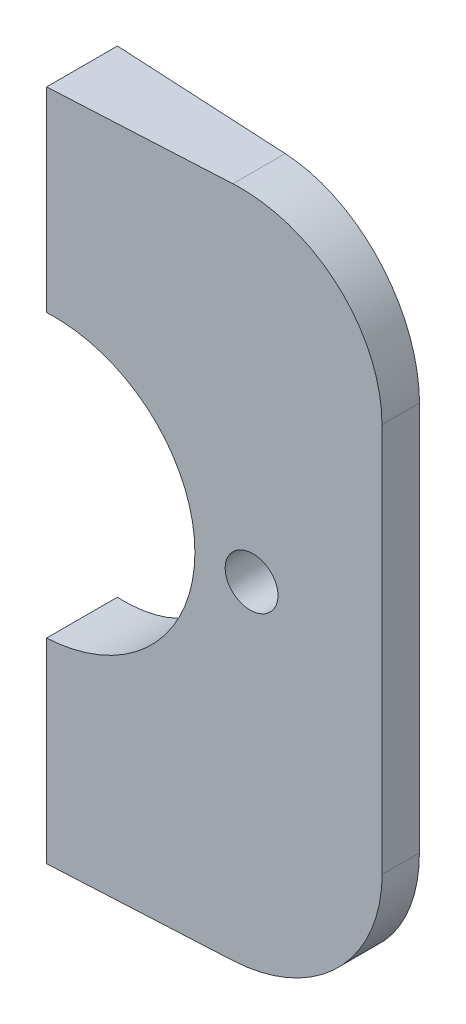
ISO-10303-21;
HEADER;
FILE_DESCRIPTION(('STEP AP214'),'2;1');
FILE_NAME('part.step','',(''),(''),'','','');
FILE_SCHEMA(('AUTOMOTIVE_DESIGN { 1 0 10303 214 1 1 1 1 }'));
ENDSEC;
DATA;
#1=APPLICATION_CONTEXT('core data for automotive mechanical design processes');
#2=APPLICATION_PROTOCOL_DEFINITION('international standard','automotive_design',2000,#1);
#3=PRODUCT_CONTEXT('',#1,'mechanical');
#4=PRODUCT('Part','Part','',(#3));
#5=PRODUCT_RELATED_PRODUCT_CATEGORY('part','',(#4));
#6=PRODUCT_DEFINITION_FORMATION('','',#4);
#7=PRODUCT_DEFINITION_CONTEXT('part definition',#1,'design');
#8=PRODUCT_DEFINITION('design','',#6,#7);
#9=PRODUCT_DEFINITION_SHAPE('','',#8);
#10=(LENGTH_UNIT() NAMED_UNIT(*) SI_UNIT(.MILLI.,.METRE.));
#11=(NAMED_UNIT(*) PLANE_ANGLE_UNIT() SI_UNIT($,.RADIAN.));
#12=(NAMED_UNIT(*) SI_UNIT($,.STERADIAN.) SOLID_ANGLE_UNIT());
#13=UNCERTAINTY_MEASURE_WITH_UNIT(LENGTH_MEASURE(1.E-05),#10,'distance_accuracy_value','');
#14=(GEOMETRIC_REPRESENTATION_CONTEXT(3) GLOBAL_UNCERTAINTY_ASSIGNED_CONTEXT((#13)) GLOBAL_UNIT_ASSIGNED_CONTEXT((#10,
#11,#12)) REPRESENTATION_CONTEXT('',''));
#15=CARTESIAN_POINT('',(0.,0.,0.));
#16=DIRECTION('',(0.,0.,1.));
#17=DIRECTION('',(1.,0.,0.));
#18=AXIS2_PLACEMENT_3D('',#15,#16,#17);
#19=CARTESIAN_POINT('',(0.,-60.325,12.7));
#20=DIRECTION('',(1.,0.,0.));
#21=DIRECTION('',(0.,0.,-1.));
#22=AXIS2_PLACEMENT_3D('',#19,#20,#21);
#23=PLANE('',#22);
#24=CARTESIAN_POINT('',(0.,40.005,6.35));
#25=DIRECTION('',(-1.,0.,0.));
#26=DIRECTION('',(0.,0.,1.));
#27=AXIS2_PLACEMENT_3D('',#24,#25,#26);
#28=CIRCLE('',#27,2.976626);
#29=CARTESIAN_POINT('',(0.,40.005,9.326626));
#30=VERTEX_POINT('',#29);
#31=EDGE_CURVE('E134',#30,#30,#28,.T.);
#32=ORIENTED_EDGE('',*,*,#31,.F.);
#33=EDGE_LOOP('',(#32));
#34=FACE_BOUND('',#33,.T.);
#35=DIRECTION('',(0.,-1.,0.));
#36=VECTOR('',#35,1.);
#37=CARTESIAN_POINT('',(0.,-60.325,0.));
#38=LINE('',#37,#36);
#39=CARTESIAN_POINT('',(0.,60.325,0.));
#40=VERTEX_POINT('',#39);
#41=CARTESIAN_POINT('',(0.,25.273,0.));
#42=VERTEX_POINT('',#41);
#43=EDGE_CURVE('E145',#40,#42,#38,.T.);
#44=ORIENTED_EDGE('',*,*,#43,.T.);
#45=DIRECTION('',(0.,0.,1.));
#46=VECTOR('',#45,1.);
#47=CARTESIAN_POINT('',(0.,25.273,0.));
#48=LINE('',#47,#46);
#49=CARTESIAN_POINT('',(0.,25.273,12.7));
#50=VERTEX_POINT('',#49);
#51=EDGE_CURVE('E149',#42,#50,#48,.T.);
#52=ORIENTED_EDGE('',*,*,#51,.T.);
#53=DIRECTION('',(0.,-1.,0.));
#54=VECTOR('',#53,1.);
#55=CARTESIAN_POINT('',(0.,-60.325,12.7));
#56=LINE('',#55,#54);
#57=CARTESIAN_POINT('',(0.,60.325,12.7));
#58=VERTEX_POINT('',#57);
#59=EDGE_CURVE('E127',#58,#50,#56,.T.);
#60=ORIENTED_EDGE('',*,*,#59,.F.);
#61=DIRECTION('',(0.,0.,-1.));
#62=VECTOR('',#61,1.);
#63=CARTESIAN_POINT('',(0.,60.325,12.7));
#64=LINE('',#63,#62);
#65=EDGE_CURVE('E158',#58,#40,#64,.T.);
#66=ORIENTED_EDGE('',*,*,#65,.T.);
#67=EDGE_LOOP('',(#44,#52,#60,#66));
#68=FACE_BOUND('',#67,.T.);
#69=ADVANCED_FACE('F34',(#34,#68),#23,.F.);
#70=CARTESIAN_POINT('',(0.,-60.325,12.7));
#71=DIRECTION('',(0.0523359562429439,0.,0.998629534754574));
#72=DIRECTION('',(0.998629534754574,0.,-0.052335956242944));
#73=AXIS2_PLACEMENT_3D('',#70,#71,#72);
#74=PLANE('',#73);
#75=DIRECTION('',(0.,1.,0.));
#76=VECTOR('',#75,1.);
#77=CARTESIAN_POINT('',(57.15,-60.325,9.70489541397419));
#78=LINE('',#77,#76);
#79=CARTESIAN_POINT('',(57.15,-34.925,9.70489541397419));
#80=VERTEX_POINT('',#79);
#81=CARTESIAN_POINT('',(57.15,34.925,9.70489541397419));
#82=VERTEX_POINT('',#81);
#83=EDGE_CURVE('E120',#80,#82,#78,.T.);
#84=ORIENTED_EDGE('',*,*,#83,.T.);
#85=CARTESIAN_POINT('',(31.75,34.925,11.0360530077634));
#86=DIRECTION('',(0.0523359562429439,0.,0.998629534754574));
#87=DIRECTION('',(0.998629534754574,0.,-0.052335956242944));
#88=AXIS2_PLACEMENT_3D('',#85,#86,#87);
#89=ELLIPSE('',#88,25.4348575883472,25.4);
#90=CARTESIAN_POINT('',(31.75,60.325,11.0360530077634));
#91=VERTEX_POINT('',#90);
#92=EDGE_CURVE('E44',#82,#91,#89,.T.);
#93=ORIENTED_EDGE('',*,*,#92,.T.);
#94=DIRECTION('',(-0.998629534754574,0.,0.052335956242944));
#95=VECTOR('',#94,1.);
#96=CARTESIAN_POINT('',(56.9934631601484,60.325,9.71309916212679));
#97=LINE('',#96,#95);
#98=EDGE_CURVE('E121',#91,#58,#97,.T.);
#99=ORIENTED_EDGE('',*,*,#98,.T.);
#100=ORIENTED_EDGE('',*,*,#59,.T.);
#101=CARTESIAN_POINT('',(0.,0.,12.7));
#102=DIRECTION('',(0.0523359562429439,0.,0.998629534754574));
#103=DIRECTION('',(-0.998629534754574,0.,0.052335956242944));
#104=AXIS2_PLACEMENT_3D('',#101,#102,#103);
#105=ELLIPSE('',#104,25.3076833004055,25.273);
#106=CARTESIAN_POINT('',(0.,-25.273,12.7));
#107=VERTEX_POINT('',#106);
#108=EDGE_CURVE('E130',#107,#50,#105,.T.);
#109=ORIENTED_EDGE('',*,*,#108,.F.);
#110=DIRECTION('',(0.,-1.,0.));
#111=VECTOR('',#110,1.);
#112=CARTESIAN_POINT('',(0.,-60.325,12.7));
#113=LINE('',#112,#111);
#114=CARTESIAN_POINT('',(0.,-60.325,12.7));
#115=VERTEX_POINT('',#114);
#116=EDGE_CURVE('E128',#107,#115,#113,.T.);
#117=ORIENTED_EDGE('',*,*,#116,.T.);
#118=DIRECTION('',(0.998629534754574,0.,-0.052335956242944));
#119=VECTOR('',#118,1.);
#120=CARTESIAN_POINT('',(56.9934631601484,-60.325,9.71309916212679));
#121=LINE('',#120,#119);
#122=CARTESIAN_POINT('',(31.75,-60.325,11.0360530077634));
#123=VERTEX_POINT('',#122);
#124=EDGE_CURVE('E124',#115,#123,#121,.T.);
#125=ORIENTED_EDGE('',*,*,#124,.T.);
#126=CARTESIAN_POINT('',(31.75,-34.925,11.0360530077634));
#127=DIRECTION('',(0.0523359562429439,0.,0.998629534754574));
#128=DIRECTION('',(0.998629534754574,0.,-0.052335956242944));
#129=AXIS2_PLACEMENT_3D('',#126,#127,#128);
#130=ELLIPSE('',#129,25.4348575883472,25.4);
#131=EDGE_CURVE('E113',#123,#80,#130,.T.);
#132=ORIENTED_EDGE('',*,*,#131,.T.);
#133=EDGE_LOOP('',(#84,#93,#99,#100,#109,#117,#125,#132));
#134=FACE_BOUND('',#133,.T.);
#135=CARTESIAN_POINT('',(34.925,0.,10.8696583085398));
#136=DIRECTION('',(0.0523359562429439,0.,0.998629534754574));
#137=DIRECTION('',(0.998629534754574,0.,-0.052335956242944));
#138=AXIS2_PLACEMENT_3D('',#135,#136,#137);
#139=ELLIPSE('',#138,4.50196979313746,4.4958);
#140=CARTESIAN_POINT('',(39.4208,0.,10.6340434144391));
#141=VERTEX_POINT('',#140);
#142=EDGE_CURVE('E109',#141,#141,#139,.T.);
#143=ORIENTED_EDGE('',*,*,#142,.F.);
#144=EDGE_LOOP('',(#143));
#145=FACE_BOUND('',#144,.T.);
#146=ADVANCED_FACE('F199',(#134,#145),#74,.T.);
#147=CARTESIAN_POINT('',(0.,-60.325,0.));
#148=DIRECTION('',(0.0523359562429439,0.,-0.998629534754574));
#149=DIRECTION('',(-0.998629534754574,0.,-0.052335956242944));
#150=AXIS2_PLACEMENT_3D('',#147,#148,#149);
#151=PLANE('',#150);
#152=DIRECTION('',(0.998629534754574,0.,0.052335956242944));
#153=VECTOR('',#152,1.);
#154=CARTESIAN_POINT('',(57.657218901898,60.325,3.02168680228467));
#155=LINE('',#154,#153);
#156=CARTESIAN_POINT('',(31.75,60.325,1.66394699223656));
#157=VERTEX_POINT('',#156);
#158=EDGE_CURVE('E95',#157,#40,#155,.F.);
#159=ORIENTED_EDGE('',*,*,#158,.F.);
#160=CARTESIAN_POINT('',(31.75,34.925,1.66394699223656));
#161=DIRECTION('',(0.0523359562429439,0.,-0.998629534754574));
#162=DIRECTION('',(-0.998629534754574,0.,-0.052335956242944));
#163=AXIS2_PLACEMENT_3D('',#160,#161,#162);
#164=ELLIPSE('',#163,25.4348575883472,25.4);
#165=CARTESIAN_POINT('',(57.15,34.925,2.99510458602581));
#166=VERTEX_POINT('',#165);
#167=EDGE_CURVE('E89',#157,#166,#164,.T.);
#168=ORIENTED_EDGE('',*,*,#167,.T.);
#169=DIRECTION('',(0.,-1.,0.));
#170=VECTOR('',#169,1.);
#171=CARTESIAN_POINT('',(57.15,-60.325,2.99510458602581));
#172=LINE('',#171,#170);
#173=CARTESIAN_POINT('',(57.15,-34.925,2.99510458602581));
#174=VERTEX_POINT('',#173);
#175=EDGE_CURVE('E92',#174,#166,#172,.F.);
#176=ORIENTED_EDGE('',*,*,#175,.F.);
#177=CARTESIAN_POINT('',(31.75,-34.925,1.66394699223656));
#178=DIRECTION('',(0.0523359562429439,0.,-0.998629534754574));
#179=DIRECTION('',(-0.998629534754574,0.,-0.052335956242944));
#180=AXIS2_PLACEMENT_3D('',#177,#178,#179);
#181=ELLIPSE('',#180,25.4348575883472,25.4);
#182=CARTESIAN_POINT('',(31.75,-60.325,1.66394699223656));
#183=VERTEX_POINT('',#182);
#184=EDGE_CURVE('E101',#174,#183,#181,.T.);
#185=ORIENTED_EDGE('',*,*,#184,.T.);
#186=DIRECTION('',(-0.998629534754574,0.,-0.052335956242944));
#187=VECTOR('',#186,1.);
#188=CARTESIAN_POINT('',(57.657218901898,-60.325,3.02168680228467));
#189=LINE('',#188,#187);
#190=CARTESIAN_POINT('',(0.,-60.325,0.));
#191=VERTEX_POINT('',#190);
#192=EDGE_CURVE('E122',#191,#183,#189,.F.);
#193=ORIENTED_EDGE('',*,*,#192,.F.);
#194=DIRECTION('',(0.,1.,0.));
#195=VECTOR('',#194,1.);
#196=CARTESIAN_POINT('',(0.,-60.325,0.));
#197=LINE('',#196,#195);
#198=CARTESIAN_POINT('',(0.,-25.273,0.));
#199=VERTEX_POINT('',#198);
#200=EDGE_CURVE('E141',#199,#191,#197,.F.);
#201=ORIENTED_EDGE('',*,*,#200,.F.);
#202=CARTESIAN_POINT('',(0.,0.,0.));
#203=DIRECTION('',(0.0523359562429439,0.,-0.998629534754574));
#204=DIRECTION('',(0.998629534754574,0.,0.052335956242944));
#205=AXIS2_PLACEMENT_3D('',#202,#203,#204);
#206=ELLIPSE('',#205,25.3076833004055,25.273);
#207=EDGE_CURVE('E133',#199,#42,#206,.F.);
#208=ORIENTED_EDGE('',*,*,#207,.T.);
#209=ORIENTED_EDGE('',*,*,#43,.F.);
#210=EDGE_LOOP('',(#159,#168,#176,#185,#193,#201,#208,#209));
#211=FACE_BOUND('',#210,.T.);
#212=CARTESIAN_POINT('',(34.925,0.,1.83034169146022));
#213=DIRECTION('',(0.0523359562429439,0.,-0.998629534754574));
#214=DIRECTION('',(-0.998629534754574,0.,-0.052335956242944));
#215=AXIS2_PLACEMENT_3D('',#212,#213,#214);
#216=ELLIPSE('',#215,4.50196979313746,4.4958);
#217=CARTESIAN_POINT('',(30.4292,0.,1.59472679735952));
#218=VERTEX_POINT('',#217);
#219=EDGE_CURVE('E38',#218,#218,#216,.F.);
#220=ORIENTED_EDGE('',*,*,#219,.T.);
#221=EDGE_LOOP('',(#220));
#222=FACE_BOUND('',#221,.T.);
#223=ADVANCED_FACE('F36',(#211,#222),#151,.T.);
#224=CARTESIAN_POINT('',(57.15,-60.325,12.7));
#225=DIRECTION('',(-1.,0.,0.));
#226=DIRECTION('',(0.,0.,1.));
#227=AXIS2_PLACEMENT_3D('',#224,#225,#226);
#228=PLANE('',#227);
#229=ORIENTED_EDGE('',*,*,#175,.T.);
#230=DIRECTION('',(0.,0.,-1.));
#231=VECTOR('',#230,1.);
#232=CARTESIAN_POINT('',(57.15,34.925,12.7));
#233=LINE('',#232,#231);
#234=EDGE_CURVE('E106',#166,#82,#233,.F.);
#235=ORIENTED_EDGE('',*,*,#234,.T.);
#236=ORIENTED_EDGE('',*,*,#83,.F.);
#237=DIRECTION('',(0.,0.,-1.));
#238=VECTOR('',#237,1.);
#239=CARTESIAN_POINT('',(57.15,-34.925,12.7));
#240=LINE('',#239,#238);
#241=EDGE_CURVE('E100',#80,#174,#240,.T.);
#242=ORIENTED_EDGE('',*,*,#241,.T.);
#243=EDGE_LOOP('',(#229,#235,#236,#242));
#244=FACE_BOUND('',#243,.T.);
#245=ADVANCED_FACE('F104',(#244),#228,.F.);
#246=CARTESIAN_POINT('',(57.15,60.325,12.7));
#247=DIRECTION('',(0.,-1.,0.));
#248=DIRECTION('',(1.,0.,0.));
#249=AXIS2_PLACEMENT_3D('',#246,#247,#248);
#250=PLANE('',#249);
#251=ORIENTED_EDGE('',*,*,#98,.F.);
#252=DIRECTION('',(0.,0.,-1.));
#253=VECTOR('',#252,1.);
#254=CARTESIAN_POINT('',(31.75,60.325,12.7));
#255=LINE('',#254,#253);
#256=EDGE_CURVE('E147',#91,#157,#255,.T.);
#257=ORIENTED_EDGE('',*,*,#256,.T.);
#258=ORIENTED_EDGE('',*,*,#158,.T.);
#259=ORIENTED_EDGE('',*,*,#65,.F.);
#260=EDGE_LOOP('',(#251,#257,#258,#259));
#261=FACE_BOUND('',#260,.T.);
#262=ADVANCED_FACE('F192',(#261),#250,.F.);
#263=CARTESIAN_POINT('',(0.,-40.005,6.35));
#264=DIRECTION('',(-1.,0.,0.));
#265=DIRECTION('',(0.,0.,1.));
#266=AXIS2_PLACEMENT_3D('',#263,#264,#265);
#267=CIRCLE('',#266,2.976626);
#268=CARTESIAN_POINT('',(0.,-40.005,9.326626));
#269=VERTEX_POINT('',#268);
#270=EDGE_CURVE('E172',#269,#269,#267,.T.);
#271=ORIENTED_EDGE('',*,*,#270,.F.);
#272=EDGE_LOOP('',(#271));
#273=FACE_BOUND('',#272,.T.);
#274=ORIENTED_EDGE('',*,*,#116,.F.);
#275=DIRECTION('',(0.,0.,1.));
#276=VECTOR('',#275,1.);
#277=CARTESIAN_POINT('',(0.,-25.273,0.));
#278=LINE('',#277,#276);
#279=EDGE_CURVE('E153',#107,#199,#278,.F.);
#280=ORIENTED_EDGE('',*,*,#279,.T.);
#281=ORIENTED_EDGE('',*,*,#200,.T.);
#282=DIRECTION('',(0.,0.,-1.));
#283=VECTOR('',#282,1.);
#284=CARTESIAN_POINT('',(0.,-60.325,12.7));
#285=LINE('',#284,#283);
#286=EDGE_CURVE('E126',#115,#191,#285,.T.);
#287=ORIENTED_EDGE('',*,*,#286,.F.);
#288=EDGE_LOOP('',(#274,#280,#281,#287));
#289=FACE_BOUND('',#288,.T.);
#290=ADVANCED_FACE('F188',(#273,#289),#23,.F.);
#291=CARTESIAN_POINT('',(57.15,-60.325,12.7));
#292=DIRECTION('',(0.,1.,0.));
#293=DIRECTION('',(-1.,0.,0.));
#294=AXIS2_PLACEMENT_3D('',#291,#292,#293);
#295=PLANE('',#294);
#296=ORIENTED_EDGE('',*,*,#192,.T.);
#297=DIRECTION('',(0.,0.,-1.));
#298=VECTOR('',#297,1.);
#299=CARTESIAN_POINT('',(31.75,-60.325,12.7));
#300=LINE('',#299,#298);
#301=EDGE_CURVE('E11',#183,#123,#300,.F.);
#302=ORIENTED_EDGE('',*,*,#301,.T.);
#303=ORIENTED_EDGE('',*,*,#124,.F.);
#304=ORIENTED_EDGE('',*,*,#286,.T.);
#305=EDGE_LOOP('',(#296,#302,#303,#304));
#306=FACE_BOUND('',#305,.T.);
#307=ADVANCED_FACE('F191',(#306),#295,.F.);
#308=CARTESIAN_POINT('',(34.925,0.,12.7));
#309=DIRECTION('',(0.,0.,-1.));
#310=DIRECTION('',(-1.,0.,0.));
#311=AXIS2_PLACEMENT_3D('',#308,#309,#310);
#312=CYLINDRICAL_SURFACE('',#311,4.4958);
#313=ORIENTED_EDGE('',*,*,#142,.T.);
#314=EDGE_LOOP('',(#313));
#315=FACE_BOUND('',#314,.T.);
#316=ORIENTED_EDGE('',*,*,#219,.F.);
#317=EDGE_LOOP('',(#316));
#318=FACE_BOUND('',#317,.T.);
#319=ADVANCED_FACE('F255',(#315,#318),#312,.F.);
#320=CARTESIAN_POINT('',(0.,0.,0.));
#321=DIRECTION('',(0.,0.,1.));
#322=DIRECTION('',(1.,0.,0.));
#323=AXIS2_PLACEMENT_3D('',#320,#321,#322);
#324=CYLINDRICAL_SURFACE('',#323,25.273);
#325=ORIENTED_EDGE('',*,*,#207,.F.);
#326=ORIENTED_EDGE('',*,*,#279,.F.);
#327=ORIENTED_EDGE('',*,*,#108,.T.);
#328=ORIENTED_EDGE('',*,*,#51,.F.);
#329=EDGE_LOOP('',(#325,#326,#327,#328));
#330=FACE_BOUND('',#329,.T.);
#331=ADVANCED_FACE('F205',(#330),#324,.F.);
#332=CARTESIAN_POINT('',(31.75,34.925,12.7));
#333=DIRECTION('',(0.,0.,-1.));
#334=DIRECTION('',(-1.,0.,0.));
#335=AXIS2_PLACEMENT_3D('',#332,#333,#334);
#336=CYLINDRICAL_SURFACE('',#335,25.4);
#337=ORIENTED_EDGE('',*,*,#92,.F.);
#338=ORIENTED_EDGE('',*,*,#234,.F.);
#339=ORIENTED_EDGE('',*,*,#167,.F.);
#340=ORIENTED_EDGE('',*,*,#256,.F.);
#341=EDGE_LOOP('',(#337,#338,#339,#340));
#342=FACE_BOUND('',#341,.T.);
#343=ADVANCED_FACE('F112',(#342),#336,.T.);
#344=CARTESIAN_POINT('',(31.75,-34.925,12.7));
#345=DIRECTION('',(0.,0.,-1.));
#346=DIRECTION('',(-1.,0.,0.));
#347=AXIS2_PLACEMENT_3D('',#344,#345,#346);
#348=CYLINDRICAL_SURFACE('',#347,25.4);
#349=ORIENTED_EDGE('',*,*,#131,.F.);
#350=ORIENTED_EDGE('',*,*,#301,.F.);
#351=ORIENTED_EDGE('',*,*,#184,.F.);
#352=ORIENTED_EDGE('',*,*,#241,.F.);
#353=EDGE_LOOP('',(#349,#350,#351,#352));
#354=FACE_BOUND('',#353,.T.);
#355=ADVANCED_FACE('F237',(#354),#348,.T.);
#356=CARTESIAN_POINT('',(0.,40.005,6.35));
#357=DIRECTION('',(-1.,0.,0.));
#358=DIRECTION('',(0.,0.,1.));
#359=AXIS2_PLACEMENT_3D('',#356,#357,#358);
#360=CYLINDRICAL_SURFACE('',#359,2.976626);
#361=CARTESIAN_POINT('',(25.4,40.005,6.35));
#362=DIRECTION('',(-1.,0.,0.));
#363=DIRECTION('',(0.,0.,1.));
#364=AXIS2_PLACEMENT_3D('',#361,#362,#363);
#365=CIRCLE('',#364,2.976626);
#366=CARTESIAN_POINT('',(25.4,40.005,9.326626));
#367=VERTEX_POINT('',#366);
#368=EDGE_CURVE('E169',#367,#367,#365,.T.);
#369=ORIENTED_EDGE('',*,*,#368,.F.);
#370=EDGE_LOOP('',(#369));
#371=FACE_BOUND('',#370,.T.);
#372=ORIENTED_EDGE('',*,*,#31,.T.);
#373=EDGE_LOOP('',(#372));
#374=FACE_BOUND('',#373,.T.);
#375=ADVANCED_FACE('F239',(#371,#374),#360,.F.);
#376=CARTESIAN_POINT('',(25.4,40.005,6.35));
#377=DIRECTION('',(-1.,0.,0.));
#378=DIRECTION('',(0.,0.,1.));
#379=AXIS2_PLACEMENT_3D('',#376,#377,#378);
#380=CONICAL_SURFACE('',#379,2.976626,1.02974425867665);
#381=CARTESIAN_POINT('',(27.1885373409735,40.005,6.35));
#382=VERTEX_POINT('',#381);
#383=VERTEX_LOOP('',#382);
#384=FACE_BOUND('',#383,.T.);
#385=ORIENTED_EDGE('',*,*,#368,.T.);
#386=EDGE_LOOP('',(#385));
#387=FACE_BOUND('',#386,.T.);
#388=ADVANCED_FACE('F184',(#384,#387),#380,.F.);
#389=CARTESIAN_POINT('',(0.,-40.005,6.35));
#390=DIRECTION('',(-1.,0.,0.));
#391=DIRECTION('',(0.,0.,1.));
#392=AXIS2_PLACEMENT_3D('',#389,#390,#391);
#393=CYLINDRICAL_SURFACE('',#392,2.976626);
#394=CARTESIAN_POINT('',(25.4,-40.005,6.35));
#395=DIRECTION('',(-1.,0.,0.));
#396=DIRECTION('',(0.,0.,1.));
#397=AXIS2_PLACEMENT_3D('',#394,#395,#396);
#398=CIRCLE('',#397,2.976626);
#399=CARTESIAN_POINT('',(25.4,-40.005,9.326626));
#400=VERTEX_POINT('',#399);
#401=EDGE_CURVE('E175',#400,#400,#398,.T.);
#402=ORIENTED_EDGE('',*,*,#401,.F.);
#403=EDGE_LOOP('',(#402));
#404=FACE_BOUND('',#403,.T.);
#405=ORIENTED_EDGE('',*,*,#270,.T.);
#406=EDGE_LOOP('',(#405));
#407=FACE_BOUND('',#406,.T.);
#408=ADVANCED_FACE('F181',(#404,#407),#393,.F.);
#409=CARTESIAN_POINT('',(25.4,-40.005,6.35));
#410=DIRECTION('',(-1.,0.,0.));
#411=DIRECTION('',(0.,0.,1.));
#412=AXIS2_PLACEMENT_3D('',#409,#410,#411);
#413=CONICAL_SURFACE('',#412,2.976626,1.02974425867665);
#414=CARTESIAN_POINT('',(27.1885373409735,-40.005,6.35));
#415=VERTEX_POINT('',#414);
#416=VERTEX_LOOP('',#415);
#417=FACE_BOUND('',#416,.T.);
#418=ORIENTED_EDGE('',*,*,#401,.T.);
#419=EDGE_LOOP('',(#418));
#420=FACE_BOUND('',#419,.T.);
#421=ADVANCED_FACE('F179',(#417,#420),#413,.F.);
#422=CLOSED_SHELL('',(#69,#146,#223,#245,#262,#290,#307,#319,#331,#343,#355,#375,#388,#408,#421));
#423=MANIFOLD_SOLID_BREP('B2',#422);
#424=ADVANCED_BREP_SHAPE_REPRESENTATION('',(#18,#423),#14);
#425=SHAPE_DEFINITION_REPRESENTATION(#9,#424);
ENDSEC;
END-ISO-10303-21;
